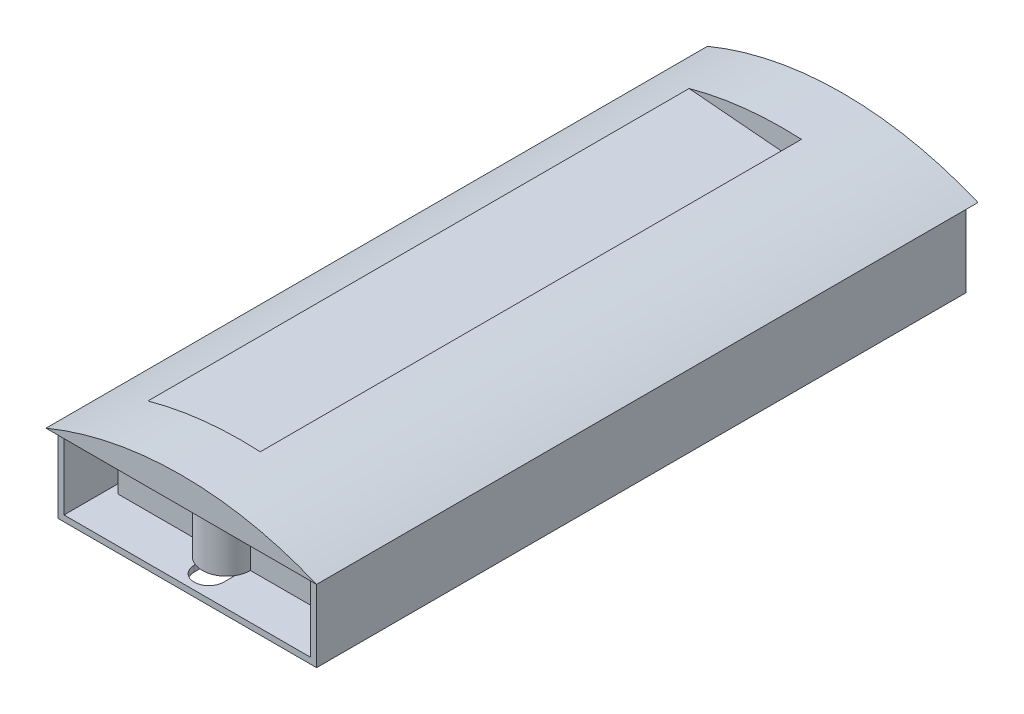
ISO-10303-21;
HEADER;
FILE_DESCRIPTION(('STEP AP214'),'2;1');
FILE_NAME('part.step','',(''),(''),'','','');
FILE_SCHEMA(('AUTOMOTIVE_DESIGN { 1 0 10303 214 1 1 1 1 }'));
ENDSEC;
DATA;
#1=APPLICATION_CONTEXT('core data for automotive mechanical design processes');
#2=APPLICATION_PROTOCOL_DEFINITION('international standard','automotive_design',2000,#1);
#3=PRODUCT_CONTEXT('',#1,'mechanical');
#4=PRODUCT('Part','Part','',(#3));
#5=PRODUCT_RELATED_PRODUCT_CATEGORY('part','',(#4));
#6=PRODUCT_DEFINITION_FORMATION('','',#4);
#7=PRODUCT_DEFINITION_CONTEXT('part definition',#1,'design');
#8=PRODUCT_DEFINITION('design','',#6,#7);
#9=PRODUCT_DEFINITION_SHAPE('','',#8);
#10=(LENGTH_UNIT() NAMED_UNIT(*) SI_UNIT(.MILLI.,.METRE.));
#11=(NAMED_UNIT(*) PLANE_ANGLE_UNIT() SI_UNIT($,.RADIAN.));
#12=(NAMED_UNIT(*) SI_UNIT($,.STERADIAN.) SOLID_ANGLE_UNIT());
#13=UNCERTAINTY_MEASURE_WITH_UNIT(LENGTH_MEASURE(1.E-05),#10,'distance_accuracy_value','');
#14=(GEOMETRIC_REPRESENTATION_CONTEXT(3) GLOBAL_UNCERTAINTY_ASSIGNED_CONTEXT((#13)) GLOBAL_UNIT_ASSIGNED_CONTEXT((#10,
#11,#12)) REPRESENTATION_CONTEXT('',''));
#15=CARTESIAN_POINT('',(0.,0.,0.));
#16=DIRECTION('',(0.,0.,1.));
#17=DIRECTION('',(1.,0.,0.));
#18=AXIS2_PLACEMENT_3D('',#15,#16,#17);
#19=CARTESIAN_POINT('',(0.,-13.,0.));
#20=DIRECTION('',(0.,1.,0.));
#21=DIRECTION('',(0.,0.,1.));
#22=AXIS2_PLACEMENT_3D('',#19,#20,#21);
#23=PLANE('',#22);
#24=CARTESIAN_POINT('',(22.5,-13.,4.6));
#25=DIRECTION('',(0.,-1.,0.));
#26=DIRECTION('',(0.,0.,-1.));
#27=AXIS2_PLACEMENT_3D('',#24,#25,#26);
#28=CIRCLE('',#27,2.45);
#29=CARTESIAN_POINT('',(20.05,-13.,4.6));
#30=VERTEX_POINT('',#29);
#31=CARTESIAN_POINT('',(24.95,-13.,4.60000000000001));
#32=VERTEX_POINT('',#31);
#33=EDGE_CURVE('E244',#30,#32,#28,.T.);
#34=ORIENTED_EDGE('',*,*,#33,.F.);
#35=DIRECTION('',(0.,0.,-1.));
#36=VECTOR('',#35,1.);
#37=CARTESIAN_POINT('',(20.05,-13.,4.6));
#38=LINE('',#37,#36);
#39=CARTESIAN_POINT('',(20.05,-13.,10.4));
#40=VERTEX_POINT('',#39);
#41=EDGE_CURVE('E252',#40,#30,#38,.T.);
#42=ORIENTED_EDGE('',*,*,#41,.F.);
#43=CARTESIAN_POINT('',(22.5,-13.,10.4));
#44=DIRECTION('',(0.,-1.,0.));
#45=DIRECTION('',(0.,0.,-1.));
#46=AXIS2_PLACEMENT_3D('',#43,#44,#45);
#47=CIRCLE('',#46,2.45);
#48=CARTESIAN_POINT('',(24.95,-13.,10.4));
#49=VERTEX_POINT('',#48);
#50=EDGE_CURVE('E249',#49,#40,#47,.T.);
#51=ORIENTED_EDGE('',*,*,#50,.F.);
#52=DIRECTION('',(0.,0.,1.));
#53=VECTOR('',#52,1.);
#54=CARTESIAN_POINT('',(24.95,-13.,4.60000000000001));
#55=LINE('',#54,#53);
#56=EDGE_CURVE('E246',#32,#49,#55,.T.);
#57=ORIENTED_EDGE('',*,*,#56,.F.);
#58=EDGE_LOOP('',(#34,#42,#51,#57));
#59=FACE_BOUND('',#58,.T.);
#60=DIRECTION('',(1.,0.,0.));
#61=VECTOR('',#60,1.);
#62=CARTESIAN_POINT('',(44.,-13.,1.));
#63=LINE('',#62,#61);
#64=CARTESIAN_POINT('',(0.999999999999984,-13.,1.));
#65=VERTEX_POINT('',#64);
#66=CARTESIAN_POINT('',(44.,-13.,1.));
#67=VERTEX_POINT('',#66);
#68=EDGE_CURVE('E278',#65,#67,#63,.T.);
#69=ORIENTED_EDGE('',*,*,#68,.T.);
#70=DIRECTION('',(0.,0.,1.));
#71=VECTOR('',#70,1.);
#72=CARTESIAN_POINT('',(44.,-13.,109.));
#73=LINE('',#72,#71);
#74=CARTESIAN_POINT('',(44.,-13.,109.));
#75=VERTEX_POINT('',#74);
#76=EDGE_CURVE('E281',#67,#75,#73,.T.);
#77=ORIENTED_EDGE('',*,*,#76,.T.);
#78=DIRECTION('',(-1.,0.,0.));
#79=VECTOR('',#78,1.);
#80=CARTESIAN_POINT('',(44.,-13.,109.));
#81=LINE('',#80,#79);
#82=CARTESIAN_POINT('',(0.999999999999984,-13.,109.));
#83=VERTEX_POINT('',#82);
#84=EDGE_CURVE('E171',#75,#83,#81,.T.);
#85=ORIENTED_EDGE('',*,*,#84,.T.);
#86=DIRECTION('',(0.,0.,-1.));
#87=VECTOR('',#86,1.);
#88=CARTESIAN_POINT('',(0.999999999999984,-13.,109.));
#89=LINE('',#88,#87);
#90=EDGE_CURVE('E275',#83,#65,#89,.T.);
#91=ORIENTED_EDGE('',*,*,#90,.T.);
#92=EDGE_LOOP('',(#69,#77,#85,#91));
#93=FACE_BOUND('',#92,.T.);
#94=CARTESIAN_POINT('',(22.5,-13.,105.4));
#95=DIRECTION('',(0.,-1.,0.));
#96=DIRECTION('',(0.,0.,1.));
#97=AXIS2_PLACEMENT_3D('',#94,#95,#96);
#98=CIRCLE('',#97,2.45);
#99=CARTESIAN_POINT('',(24.95,-13.,105.4));
#100=VERTEX_POINT('',#99);
#101=CARTESIAN_POINT('',(20.05,-13.,105.4));
#102=VERTEX_POINT('',#101);
#103=EDGE_CURVE('E215',#100,#102,#98,.T.);
#104=ORIENTED_EDGE('',*,*,#103,.F.);
#105=DIRECTION('',(0.,0.,1.));
#106=VECTOR('',#105,1.);
#107=CARTESIAN_POINT('',(24.95,-13.,105.4));
#108=LINE('',#107,#106);
#109=CARTESIAN_POINT('',(24.95,-13.,99.6));
#110=VERTEX_POINT('',#109);
#111=EDGE_CURVE('E222',#110,#100,#108,.T.);
#112=ORIENTED_EDGE('',*,*,#111,.F.);
#113=CARTESIAN_POINT('',(22.5,-13.,99.6));
#114=DIRECTION('',(0.,-1.,0.));
#115=DIRECTION('',(0.,0.,1.));
#116=AXIS2_PLACEMENT_3D('',#113,#114,#115);
#117=CIRCLE('',#116,2.45);
#118=CARTESIAN_POINT('',(20.05,-13.,99.6));
#119=VERTEX_POINT('',#118);
#120=EDGE_CURVE('E220',#119,#110,#117,.T.);
#121=ORIENTED_EDGE('',*,*,#120,.F.);
#122=DIRECTION('',(0.,0.,-1.));
#123=VECTOR('',#122,1.);
#124=CARTESIAN_POINT('',(20.05,-13.,105.4));
#125=LINE('',#124,#123);
#126=EDGE_CURVE('E217',#102,#119,#125,.T.);
#127=ORIENTED_EDGE('',*,*,#126,.F.);
#128=EDGE_LOOP('',(#104,#112,#121,#127));
#129=FACE_BOUND('',#128,.T.);
#130=ADVANCED_FACE('F49',(#59,#93,#129),#23,.F.);
#131=CARTESIAN_POINT('',(0.,-12.,0.));
#132=DIRECTION('',(0.,1.,0.));
#133=DIRECTION('',(0.,0.,1.));
#134=AXIS2_PLACEMENT_3D('',#131,#132,#133);
#135=PLANE('',#134);
#136=DIRECTION('',(0.,0.,1.));
#137=VECTOR('',#136,1.);
#138=CARTESIAN_POINT('',(43.,-12.,0.));
#139=LINE('',#138,#137);
#140=CARTESIAN_POINT('',(43.,-12.,1.));
#141=VERTEX_POINT('',#140);
#142=CARTESIAN_POINT('',(43.,-12.,109.));
#143=VERTEX_POINT('',#142);
#144=EDGE_CURVE('E196',#141,#143,#139,.T.);
#145=ORIENTED_EDGE('',*,*,#144,.F.);
#146=DIRECTION('',(1.,0.,0.));
#147=VECTOR('',#146,1.);
#148=CARTESIAN_POINT('',(44.,-12.,1.));
#149=LINE('',#148,#147);
#150=CARTESIAN_POINT('',(1.99999999999998,-12.,1.));
#151=VERTEX_POINT('',#150);
#152=EDGE_CURVE('E274',#151,#141,#149,.T.);
#153=ORIENTED_EDGE('',*,*,#152,.F.);
#154=DIRECTION('',(0.,0.,-1.));
#155=VECTOR('',#154,1.);
#156=CARTESIAN_POINT('',(1.99999999999998,-12.,0.));
#157=LINE('',#156,#155);
#158=CARTESIAN_POINT('',(1.99999999999998,-12.,109.));
#159=VERTEX_POINT('',#158);
#160=EDGE_CURVE('E203',#159,#151,#157,.T.);
#161=ORIENTED_EDGE('',*,*,#160,.F.);
#162=DIRECTION('',(-1.,0.,0.));
#163=VECTOR('',#162,1.);
#164=CARTESIAN_POINT('',(44.,-12.,109.));
#165=LINE('',#164,#163);
#166=EDGE_CURVE('E279',#143,#159,#165,.T.);
#167=ORIENTED_EDGE('',*,*,#166,.F.);
#168=EDGE_LOOP('',(#145,#153,#161,#167));
#169=FACE_BOUND('',#168,.T.);
#170=DIRECTION('',(0.,0.,-1.));
#171=VECTOR('',#170,1.);
#172=CARTESIAN_POINT('',(20.05,-12.,4.6));
#173=LINE('',#172,#171);
#174=CARTESIAN_POINT('',(20.05,-12.,10.4));
#175=VERTEX_POINT('',#174);
#176=CARTESIAN_POINT('',(20.05,-12.,4.6));
#177=VERTEX_POINT('',#176);
#178=EDGE_CURVE('E247',#175,#177,#173,.T.);
#179=ORIENTED_EDGE('',*,*,#178,.T.);
#180=CARTESIAN_POINT('',(22.5,-12.,4.6));
#181=DIRECTION('',(0.,-1.,0.));
#182=DIRECTION('',(0.,0.,-1.));
#183=AXIS2_PLACEMENT_3D('',#180,#181,#182);
#184=CIRCLE('',#183,2.45);
#185=CARTESIAN_POINT('',(24.95,-12.,4.60000000000001));
#186=VERTEX_POINT('',#185);
#187=EDGE_CURVE('E243',#177,#186,#184,.T.);
#188=ORIENTED_EDGE('',*,*,#187,.T.);
#189=DIRECTION('',(0.,0.,1.));
#190=VECTOR('',#189,1.);
#191=CARTESIAN_POINT('',(24.95,-12.,4.60000000000001));
#192=LINE('',#191,#190);
#193=CARTESIAN_POINT('',(24.95,-12.,10.4));
#194=VERTEX_POINT('',#193);
#195=EDGE_CURVE('E257',#186,#194,#192,.T.);
#196=ORIENTED_EDGE('',*,*,#195,.T.);
#197=CARTESIAN_POINT('',(22.5,-12.,10.4));
#198=DIRECTION('',(0.,-1.,0.));
#199=DIRECTION('',(0.,0.,-1.));
#200=AXIS2_PLACEMENT_3D('',#197,#198,#199);
#201=CIRCLE('',#200,2.45);
#202=EDGE_CURVE('E260',#194,#175,#201,.T.);
#203=ORIENTED_EDGE('',*,*,#202,.T.);
#204=EDGE_LOOP('',(#179,#188,#196,#203));
#205=FACE_BOUND('',#204,.T.);
#206=DIRECTION('',(0.,0.,1.));
#207=VECTOR('',#206,1.);
#208=CARTESIAN_POINT('',(24.95,-12.,105.4));
#209=LINE('',#208,#207);
#210=CARTESIAN_POINT('',(24.95,-12.,99.6));
#211=VERTEX_POINT('',#210);
#212=CARTESIAN_POINT('',(24.95,-12.,105.4));
#213=VERTEX_POINT('',#212);
#214=EDGE_CURVE('E218',#211,#213,#209,.T.);
#215=ORIENTED_EDGE('',*,*,#214,.T.);
#216=CARTESIAN_POINT('',(22.5,-12.,105.4));
#217=DIRECTION('',(0.,-1.,0.));
#218=DIRECTION('',(0.,0.,1.));
#219=AXIS2_PLACEMENT_3D('',#216,#217,#218);
#220=CIRCLE('',#219,2.45);
#221=CARTESIAN_POINT('',(20.05,-12.,105.4));
#222=VERTEX_POINT('',#221);
#223=EDGE_CURVE('E214',#213,#222,#220,.T.);
#224=ORIENTED_EDGE('',*,*,#223,.T.);
#225=DIRECTION('',(0.,0.,-1.));
#226=VECTOR('',#225,1.);
#227=CARTESIAN_POINT('',(20.05,-12.,105.4));
#228=LINE('',#227,#226);
#229=CARTESIAN_POINT('',(20.05,-12.,99.6));
#230=VERTEX_POINT('',#229);
#231=EDGE_CURVE('E227',#222,#230,#228,.T.);
#232=ORIENTED_EDGE('',*,*,#231,.T.);
#233=CARTESIAN_POINT('',(22.5,-12.,99.6));
#234=DIRECTION('',(0.,-1.,0.));
#235=DIRECTION('',(0.,0.,1.));
#236=AXIS2_PLACEMENT_3D('',#233,#234,#235);
#237=CIRCLE('',#236,2.45);
#238=EDGE_CURVE('E230',#230,#211,#237,.T.);
#239=ORIENTED_EDGE('',*,*,#238,.T.);
#240=EDGE_LOOP('',(#215,#224,#232,#239));
#241=FACE_BOUND('',#240,.T.);
#242=ADVANCED_FACE('F303',(#169,#205,#241),#135,.T.);
#243=CARTESIAN_POINT('',(0.999999999999984,-13.,109.));
#244=DIRECTION('',(1.,0.,0.));
#245=DIRECTION('',(0.,0.,-1.));
#246=AXIS2_PLACEMENT_3D('',#243,#244,#245);
#247=PLANE('',#246);
#248=DIRECTION('',(0.,1.,0.));
#249=VECTOR('',#248,1.);
#250=CARTESIAN_POINT('',(0.999999999999984,-13.,109.));
#251=LINE('',#250,#249);
#252=CARTESIAN_POINT('',(0.999999999999984,-1.,109.));
#253=VERTEX_POINT('',#252);
#254=EDGE_CURVE('E174',#83,#253,#251,.T.);
#255=ORIENTED_EDGE('',*,*,#254,.T.);
#256=DIRECTION('',(0.,0.,1.));
#257=VECTOR('',#256,1.);
#258=CARTESIAN_POINT('',(0.999999999999984,-1.,-11.0415945787923));
#259=LINE('',#258,#257);
#260=CARTESIAN_POINT('',(0.999999999999984,-1.,1.));
#261=VERTEX_POINT('',#260);
#262=EDGE_CURVE('E201',#261,#253,#259,.T.);
#263=ORIENTED_EDGE('',*,*,#262,.F.);
#264=DIRECTION('',(0.,1.,0.));
#265=VECTOR('',#264,1.);
#266=CARTESIAN_POINT('',(0.999999999999984,-13.,1.));
#267=LINE('',#266,#265);
#268=EDGE_CURVE('E12',#65,#261,#267,.T.);
#269=ORIENTED_EDGE('',*,*,#268,.F.);
#270=ORIENTED_EDGE('',*,*,#90,.F.);
#271=EDGE_LOOP('',(#255,#263,#269,#270));
#272=FACE_BOUND('',#271,.T.);
#273=ADVANCED_FACE('F51',(#272),#247,.F.);
#274=CARTESIAN_POINT('',(44.,-13.,1.));
#275=DIRECTION('',(0.,0.,1.));
#276=DIRECTION('',(1.,0.,0.));
#277=AXIS2_PLACEMENT_3D('',#274,#275,#276);
#278=PLANE('',#277);
#279=ORIENTED_EDGE('',*,*,#152,.T.);
#280=DIRECTION('',(0.,1.,0.));
#281=VECTOR('',#280,1.);
#282=CARTESIAN_POINT('',(43.,-13.,1.));
#283=LINE('',#282,#281);
#284=CARTESIAN_POINT('',(43.,-0.999999999999996,1.));
#285=VERTEX_POINT('',#284);
#286=EDGE_CURVE('E191',#141,#285,#283,.T.);
#287=ORIENTED_EDGE('',*,*,#286,.T.);
#288=DIRECTION('',(1.,0.,0.));
#289=VECTOR('',#288,1.);
#290=CARTESIAN_POINT('',(44.,-0.999999999999996,1.));
#291=LINE('',#290,#289);
#292=CARTESIAN_POINT('',(44.,-0.999999999999996,1.));
#293=VERTEX_POINT('',#292);
#294=EDGE_CURVE('E194',#285,#293,#291,.T.);
#295=ORIENTED_EDGE('',*,*,#294,.T.);
#296=DIRECTION('',(0.,1.,0.));
#297=VECTOR('',#296,1.);
#298=CARTESIAN_POINT('',(44.,-13.,1.));
#299=LINE('',#298,#297);
#300=EDGE_CURVE('E57',#67,#293,#299,.T.);
#301=ORIENTED_EDGE('',*,*,#300,.F.);
#302=ORIENTED_EDGE('',*,*,#68,.F.);
#303=ORIENTED_EDGE('',*,*,#268,.T.);
#304=DIRECTION('',(1.,0.,0.));
#305=VECTOR('',#304,1.);
#306=CARTESIAN_POINT('',(0.999999999999984,-1.,1.));
#307=LINE('',#306,#305);
#308=CARTESIAN_POINT('',(1.99999999999998,-1.,1.));
#309=VERTEX_POINT('',#308);
#310=EDGE_CURVE('E200',#261,#309,#307,.T.);
#311=ORIENTED_EDGE('',*,*,#310,.T.);
#312=DIRECTION('',(0.,-1.,0.));
#313=VECTOR('',#312,1.);
#314=CARTESIAN_POINT('',(1.99999999999998,-13.,1.));
#315=LINE('',#314,#313);
#316=EDGE_CURVE('E64',#309,#151,#315,.T.);
#317=ORIENTED_EDGE('',*,*,#316,.T.);
#318=EDGE_LOOP('',(#279,#287,#295,#301,#302,#303,#311,#317));
#319=FACE_BOUND('',#318,.T.);
#320=ADVANCED_FACE('F305',(#319),#278,.F.);
#321=CARTESIAN_POINT('',(44.,-13.,109.));
#322=DIRECTION('',(-1.,0.,0.));
#323=DIRECTION('',(0.,0.,1.));
#324=AXIS2_PLACEMENT_3D('',#321,#322,#323);
#325=PLANE('',#324);
#326=ORIENTED_EDGE('',*,*,#300,.T.);
#327=DIRECTION('',(0.,0.,1.));
#328=VECTOR('',#327,1.);
#329=CARTESIAN_POINT('',(44.,-0.999999999999996,-11.0415945787923));
#330=LINE('',#329,#328);
#331=CARTESIAN_POINT('',(44.,-0.999999999999996,109.));
#332=VERTEX_POINT('',#331);
#333=EDGE_CURVE('E177',#293,#332,#330,.T.);
#334=ORIENTED_EDGE('',*,*,#333,.T.);
#335=DIRECTION('',(0.,1.,0.));
#336=VECTOR('',#335,1.);
#337=CARTESIAN_POINT('',(44.,-13.,109.));
#338=LINE('',#337,#336);
#339=EDGE_CURVE('E163',#75,#332,#338,.T.);
#340=ORIENTED_EDGE('',*,*,#339,.F.);
#341=ORIENTED_EDGE('',*,*,#76,.F.);
#342=EDGE_LOOP('',(#326,#334,#340,#341));
#343=FACE_BOUND('',#342,.T.);
#344=ADVANCED_FACE('F178',(#343),#325,.F.);
#345=CARTESIAN_POINT('',(44.,-13.,109.));
#346=DIRECTION('',(0.,0.,-1.));
#347=DIRECTION('',(-1.,0.,0.));
#348=AXIS2_PLACEMENT_3D('',#345,#346,#347);
#349=PLANE('',#348);
#350=ORIENTED_EDGE('',*,*,#254,.F.);
#351=ORIENTED_EDGE('',*,*,#84,.F.);
#352=ORIENTED_EDGE('',*,*,#339,.T.);
#353=DIRECTION('',(-1.,0.,0.));
#354=VECTOR('',#353,1.);
#355=CARTESIAN_POINT('',(44.,-0.999999999999996,109.));
#356=LINE('',#355,#354);
#357=CARTESIAN_POINT('',(43.,-0.999999999999996,109.));
#358=VERTEX_POINT('',#357);
#359=EDGE_CURVE('E169',#332,#358,#356,.T.);
#360=ORIENTED_EDGE('',*,*,#359,.T.);
#361=DIRECTION('',(0.,-1.,0.));
#362=VECTOR('',#361,1.);
#363=CARTESIAN_POINT('',(43.,-13.,109.));
#364=LINE('',#363,#362);
#365=EDGE_CURVE('E184',#358,#143,#364,.T.);
#366=ORIENTED_EDGE('',*,*,#365,.T.);
#367=ORIENTED_EDGE('',*,*,#166,.T.);
#368=DIRECTION('',(0.,1.,0.));
#369=VECTOR('',#368,1.);
#370=CARTESIAN_POINT('',(1.99999999999998,-13.,109.));
#371=LINE('',#370,#369);
#372=CARTESIAN_POINT('',(1.99999999999998,-1.,109.));
#373=VERTEX_POINT('',#372);
#374=EDGE_CURVE('E198',#159,#373,#371,.T.);
#375=ORIENTED_EDGE('',*,*,#374,.T.);
#376=DIRECTION('',(-1.,0.,0.));
#377=VECTOR('',#376,1.);
#378=CARTESIAN_POINT('',(0.999999999999984,-1.,109.));
#379=LINE('',#378,#377);
#380=EDGE_CURVE('E205',#373,#253,#379,.T.);
#381=ORIENTED_EDGE('',*,*,#380,.T.);
#382=EDGE_LOOP('',(#350,#351,#352,#360,#366,#367,#375,#381));
#383=FACE_BOUND('',#382,.T.);
#384=ADVANCED_FACE('F166',(#383),#349,.F.);
#385=CARTESIAN_POINT('',(22.5,-13.,4.6));
#386=DIRECTION('',(0.,1.,0.));
#387=DIRECTION('',(0.,0.,1.));
#388=AXIS2_PLACEMENT_3D('',#385,#386,#387);
#389=CYLINDRICAL_SURFACE('',#388,2.45);
#390=ORIENTED_EDGE('',*,*,#187,.F.);
#391=DIRECTION('',(0.,1.,0.));
#392=VECTOR('',#391,1.);
#393=CARTESIAN_POINT('',(20.05,-13.,4.6));
#394=LINE('',#393,#392);
#395=EDGE_CURVE('E254',#30,#177,#394,.T.);
#396=ORIENTED_EDGE('',*,*,#395,.F.);
#397=ORIENTED_EDGE('',*,*,#33,.T.);
#398=DIRECTION('',(0.,1.,0.));
#399=VECTOR('',#398,1.);
#400=CARTESIAN_POINT('',(24.95,-13.,4.60000000000001));
#401=LINE('',#400,#399);
#402=EDGE_CURVE('E271',#32,#186,#401,.T.);
#403=ORIENTED_EDGE('',*,*,#402,.T.);
#404=EDGE_LOOP('',(#390,#396,#397,#403));
#405=FACE_BOUND('',#404,.T.);
#406=ADVANCED_FACE('F326',(#405),#389,.F.);
#407=CARTESIAN_POINT('',(24.95,-13.,4.60000000000001));
#408=DIRECTION('',(-1.,0.,0.));
#409=DIRECTION('',(0.,0.,1.));
#410=AXIS2_PLACEMENT_3D('',#407,#408,#409);
#411=PLANE('',#410);
#412=ORIENTED_EDGE('',*,*,#195,.F.);
#413=ORIENTED_EDGE('',*,*,#402,.F.);
#414=ORIENTED_EDGE('',*,*,#56,.T.);
#415=DIRECTION('',(0.,1.,0.));
#416=VECTOR('',#415,1.);
#417=CARTESIAN_POINT('',(24.95,-13.,10.4));
#418=LINE('',#417,#416);
#419=EDGE_CURVE('E269',#49,#194,#418,.T.);
#420=ORIENTED_EDGE('',*,*,#419,.T.);
#421=EDGE_LOOP('',(#412,#413,#414,#420));
#422=FACE_BOUND('',#421,.T.);
#423=ADVANCED_FACE('F407',(#422),#411,.T.);
#424=CARTESIAN_POINT('',(22.5,-13.,10.4));
#425=DIRECTION('',(0.,1.,0.));
#426=DIRECTION('',(0.,0.,1.));
#427=AXIS2_PLACEMENT_3D('',#424,#425,#426);
#428=CYLINDRICAL_SURFACE('',#427,2.45);
#429=ORIENTED_EDGE('',*,*,#202,.F.);
#430=ORIENTED_EDGE('',*,*,#419,.F.);
#431=ORIENTED_EDGE('',*,*,#50,.T.);
#432=DIRECTION('',(0.,1.,0.));
#433=VECTOR('',#432,1.);
#434=CARTESIAN_POINT('',(20.05,-13.,10.4));
#435=LINE('',#434,#433);
#436=EDGE_CURVE('E267',#40,#175,#435,.T.);
#437=ORIENTED_EDGE('',*,*,#436,.T.);
#438=EDGE_LOOP('',(#429,#430,#431,#437));
#439=FACE_BOUND('',#438,.T.);
#440=ADVANCED_FACE('F397',(#439),#428,.F.);
#441=CARTESIAN_POINT('',(20.05,-13.,4.6));
#442=DIRECTION('',(1.,0.,0.));
#443=DIRECTION('',(0.,0.,-1.));
#444=AXIS2_PLACEMENT_3D('',#441,#442,#443);
#445=PLANE('',#444);
#446=ORIENTED_EDGE('',*,*,#178,.F.);
#447=ORIENTED_EDGE('',*,*,#436,.F.);
#448=ORIENTED_EDGE('',*,*,#41,.T.);
#449=ORIENTED_EDGE('',*,*,#395,.T.);
#450=EDGE_LOOP('',(#446,#447,#448,#449));
#451=FACE_BOUND('',#450,.T.);
#452=ADVANCED_FACE('F387',(#451),#445,.T.);
#453=CARTESIAN_POINT('',(22.5,-13.,105.4));
#454=DIRECTION('',(0.,1.,0.));
#455=DIRECTION('',(0.,0.,1.));
#456=AXIS2_PLACEMENT_3D('',#453,#454,#455);
#457=CYLINDRICAL_SURFACE('',#456,2.45);
#458=ORIENTED_EDGE('',*,*,#223,.F.);
#459=DIRECTION('',(0.,1.,0.));
#460=VECTOR('',#459,1.);
#461=CARTESIAN_POINT('',(24.95,-13.,105.4));
#462=LINE('',#461,#460);
#463=EDGE_CURVE('E224',#100,#213,#462,.T.);
#464=ORIENTED_EDGE('',*,*,#463,.F.);
#465=ORIENTED_EDGE('',*,*,#103,.T.);
#466=DIRECTION('',(0.,1.,0.));
#467=VECTOR('',#466,1.);
#468=CARTESIAN_POINT('',(20.05,-13.,105.4));
#469=LINE('',#468,#467);
#470=EDGE_CURVE('E240',#102,#222,#469,.T.);
#471=ORIENTED_EDGE('',*,*,#470,.T.);
#472=EDGE_LOOP('',(#458,#464,#465,#471));
#473=FACE_BOUND('',#472,.T.);
#474=ADVANCED_FACE('F377',(#473),#457,.F.);
#475=CARTESIAN_POINT('',(20.05,-13.,105.4));
#476=DIRECTION('',(1.,0.,0.));
#477=DIRECTION('',(0.,0.,-1.));
#478=AXIS2_PLACEMENT_3D('',#475,#476,#477);
#479=PLANE('',#478);
#480=ORIENTED_EDGE('',*,*,#231,.F.);
#481=ORIENTED_EDGE('',*,*,#470,.F.);
#482=ORIENTED_EDGE('',*,*,#126,.T.);
#483=DIRECTION('',(0.,1.,0.));
#484=VECTOR('',#483,1.);
#485=CARTESIAN_POINT('',(20.05,-13.,99.6));
#486=LINE('',#485,#484);
#487=EDGE_CURVE('E238',#119,#230,#486,.T.);
#488=ORIENTED_EDGE('',*,*,#487,.T.);
#489=EDGE_LOOP('',(#480,#481,#482,#488));
#490=FACE_BOUND('',#489,.T.);
#491=ADVANCED_FACE('F367',(#490),#479,.T.);
#492=CARTESIAN_POINT('',(22.5,-13.,99.6));
#493=DIRECTION('',(0.,1.,0.));
#494=DIRECTION('',(0.,0.,1.));
#495=AXIS2_PLACEMENT_3D('',#492,#493,#494);
#496=CYLINDRICAL_SURFACE('',#495,2.45);
#497=ORIENTED_EDGE('',*,*,#238,.F.);
#498=ORIENTED_EDGE('',*,*,#487,.F.);
#499=ORIENTED_EDGE('',*,*,#120,.T.);
#500=DIRECTION('',(0.,1.,0.));
#501=VECTOR('',#500,1.);
#502=CARTESIAN_POINT('',(24.95,-13.,99.6));
#503=LINE('',#502,#501);
#504=EDGE_CURVE('E72',#110,#211,#503,.T.);
#505=ORIENTED_EDGE('',*,*,#504,.T.);
#506=EDGE_LOOP('',(#497,#498,#499,#505));
#507=FACE_BOUND('',#506,.T.);
#508=ADVANCED_FACE('F357',(#507),#496,.F.);
#509=CARTESIAN_POINT('',(24.95,-13.,105.4));
#510=DIRECTION('',(-1.,0.,0.));
#511=DIRECTION('',(0.,0.,1.));
#512=AXIS2_PLACEMENT_3D('',#509,#510,#511);
#513=PLANE('',#512);
#514=ORIENTED_EDGE('',*,*,#214,.F.);
#515=ORIENTED_EDGE('',*,*,#504,.F.);
#516=ORIENTED_EDGE('',*,*,#111,.T.);
#517=ORIENTED_EDGE('',*,*,#463,.T.);
#518=EDGE_LOOP('',(#514,#515,#516,#517));
#519=FACE_BOUND('',#518,.T.);
#520=ADVANCED_FACE('F352',(#519),#513,.T.);
#521=CARTESIAN_POINT('',(0.999999999999984,-1.,-11.0415945787923));
#522=DIRECTION('',(0.,1.,0.));
#523=DIRECTION('',(0.,0.,1.));
#524=AXIS2_PLACEMENT_3D('',#521,#522,#523);
#525=PLANE('',#524);
#526=ORIENTED_EDGE('',*,*,#310,.F.);
#527=ORIENTED_EDGE('',*,*,#262,.T.);
#528=ORIENTED_EDGE('',*,*,#380,.F.);
#529=DIRECTION('',(0.,0.,1.));
#530=VECTOR('',#529,1.);
#531=CARTESIAN_POINT('',(1.99999999999998,-1.,-11.0415945787923));
#532=LINE('',#531,#530);
#533=EDGE_CURVE('E208',#309,#373,#532,.T.);
#534=ORIENTED_EDGE('',*,*,#533,.F.);
#535=EDGE_LOOP('',(#526,#527,#528,#534));
#536=FACE_BOUND('',#535,.T.);
#537=ADVANCED_FACE('F293',(#536),#525,.T.);
#538=CARTESIAN_POINT('',(1.99999999999998,-13.,-11.0415945787923));
#539=DIRECTION('',(1.,0.,0.));
#540=DIRECTION('',(0.,0.,-1.));
#541=AXIS2_PLACEMENT_3D('',#538,#539,#540);
#542=PLANE('',#541);
#543=ORIENTED_EDGE('',*,*,#374,.F.);
#544=ORIENTED_EDGE('',*,*,#160,.T.);
#545=ORIENTED_EDGE('',*,*,#316,.F.);
#546=ORIENTED_EDGE('',*,*,#533,.T.);
#547=EDGE_LOOP('',(#543,#544,#545,#546));
#548=FACE_BOUND('',#547,.T.);
#549=ADVANCED_FACE('F299',(#548),#542,.T.);
#550=CARTESIAN_POINT('',(43.,-13.,-11.0415945787923));
#551=DIRECTION('',(-1.,0.,0.));
#552=DIRECTION('',(0.,0.,1.));
#553=AXIS2_PLACEMENT_3D('',#550,#551,#552);
#554=PLANE('',#553);
#555=ORIENTED_EDGE('',*,*,#286,.F.);
#556=ORIENTED_EDGE('',*,*,#144,.T.);
#557=ORIENTED_EDGE('',*,*,#365,.F.);
#558=DIRECTION('',(0.,0.,1.));
#559=VECTOR('',#558,1.);
#560=CARTESIAN_POINT('',(43.,-0.999999999999996,-11.0415945787923));
#561=LINE('',#560,#559);
#562=EDGE_CURVE('E183',#285,#358,#561,.T.);
#563=ORIENTED_EDGE('',*,*,#562,.F.);
#564=EDGE_LOOP('',(#555,#556,#557,#563));
#565=FACE_BOUND('',#564,.T.);
#566=ADVANCED_FACE('F307',(#565),#554,.T.);
#567=CARTESIAN_POINT('',(44.,-0.999999999999996,-11.0415945787923));
#568=DIRECTION('',(0.,1.,0.));
#569=DIRECTION('',(-1.,0.,0.));
#570=AXIS2_PLACEMENT_3D('',#567,#568,#569);
#571=PLANE('',#570);
#572=ORIENTED_EDGE('',*,*,#294,.F.);
#573=ORIENTED_EDGE('',*,*,#562,.T.);
#574=ORIENTED_EDGE('',*,*,#359,.F.);
#575=ORIENTED_EDGE('',*,*,#333,.F.);
#576=EDGE_LOOP('',(#572,#573,#574,#575));
#577=FACE_BOUND('',#576,.T.);
#578=ADVANCED_FACE('F186',(#577),#571,.T.);
#579=CLOSED_SHELL('',(#130,#242,#273,#320,#344,#384,#406,#423,#440,#452,#474,#491,#508,#520,
#537,#549,#566,#578));
#580=MANIFOLD_SOLID_BREP('B2',#579);
#581=CARTESIAN_POINT('',(22.5,-54.,110.));
#582=DIRECTION('',(0.,0.,-1.));
#583=DIRECTION('',(-1.,0.,0.));
#584=AXIS2_PLACEMENT_3D('',#581,#582,#583);
#585=CYLINDRICAL_SURFACE('',#584,58.5);
#586=CARTESIAN_POINT('',(22.5,-54.,0.));
#587=DIRECTION('',(0.,0.,1.));
#588=DIRECTION('',(-1.,0.,0.));
#589=AXIS2_PLACEMENT_3D('',#586,#587,#588);
#590=CIRCLE('',#589,58.5);
#591=CARTESIAN_POINT('',(45.,0.,0.));
#592=VERTEX_POINT('',#591);
#593=CARTESIAN_POINT('',(0.,0.,0.));
#594=VERTEX_POINT('',#593);
#595=EDGE_CURVE('E700',#592,#594,#590,.T.);
#596=ORIENTED_EDGE('',*,*,#595,.T.);
#597=DIRECTION('',(0.,0.,-1.));
#598=VECTOR('',#597,1.);
#599=CARTESIAN_POINT('',(0.,0.,110.));
#600=LINE('',#599,#598);
#601=CARTESIAN_POINT('',(0.,0.,110.));
#602=VERTEX_POINT('',#601);
#603=EDGE_CURVE('E613',#602,#594,#600,.T.);
#604=ORIENTED_EDGE('',*,*,#603,.F.);
#605=CARTESIAN_POINT('',(22.5,-54.,110.));
#606=DIRECTION('',(0.,0.,1.));
#607=DIRECTION('',(-1.,0.,0.));
#608=AXIS2_PLACEMENT_3D('',#605,#606,#607);
#609=CIRCLE('',#608,58.5);
#610=CARTESIAN_POINT('',(45.,0.,110.));
#611=VERTEX_POINT('',#610);
#612=EDGE_CURVE('E701',#611,#602,#609,.T.);
#613=ORIENTED_EDGE('',*,*,#612,.F.);
#614=DIRECTION('',(0.,0.,-1.));
#615=VECTOR('',#614,1.);
#616=CARTESIAN_POINT('',(45.,0.,110.));
#617=LINE('',#616,#615);
#618=EDGE_CURVE('E707',#611,#592,#617,.T.);
#619=ORIENTED_EDGE('',*,*,#618,.T.);
#620=EDGE_LOOP('',(#596,#604,#613,#619));
#621=FACE_BOUND('',#620,.T.);
#622=CARTESIAN_POINT('',(22.5,-54.,9.99999999999999));
#623=DIRECTION('',(0.,0.,1.));
#624=DIRECTION('',(1.,0.,0.));
#625=AXIS2_PLACEMENT_3D('',#622,#623,#624);
#626=CIRCLE('',#625,58.5);
#627=CARTESIAN_POINT('',(25.6355375998647,4.415908825934,10.));
#628=VERTEX_POINT('',#627);
#629=CARTESIAN_POINT('',(6.95185149151565,2.39596685897064,9.99999999999999));
#630=VERTEX_POINT('',#629);
#631=EDGE_CURVE('E47',#628,#630,#626,.T.);
#632=ORIENTED_EDGE('',*,*,#631,.F.);
#633=DIRECTION('',(0.,0.,1.));
#634=VECTOR('',#633,1.);
#635=CARTESIAN_POINT('',(25.6355375998647,4.415908825934,10.));
#636=LINE('',#635,#634);
#637=CARTESIAN_POINT('',(25.6355375998647,4.415908825934,100.));
#638=VERTEX_POINT('',#637);
#639=EDGE_CURVE('E618',#628,#638,#636,.T.);
#640=ORIENTED_EDGE('',*,*,#639,.T.);
#641=CARTESIAN_POINT('',(22.5,-54.,100.));
#642=DIRECTION('',(0.,0.,1.));
#643=DIRECTION('',(1.,0.,0.));
#644=AXIS2_PLACEMENT_3D('',#641,#642,#643);
#645=CIRCLE('',#644,58.5);
#646=CARTESIAN_POINT('',(6.95185149151565,2.39596685897064,100.));
#647=VERTEX_POINT('',#646);
#648=EDGE_CURVE('E606',#638,#647,#645,.T.);
#649=ORIENTED_EDGE('',*,*,#648,.T.);
#650=DIRECTION('',(0.,0.,-1.));
#651=VECTOR('',#650,1.);
#652=CARTESIAN_POINT('',(6.95185149151565,2.39596685897064,110.));
#653=LINE('',#652,#651);
#654=EDGE_CURVE('E514',#630,#647,#653,.F.);
#655=ORIENTED_EDGE('',*,*,#654,.F.);
#656=EDGE_LOOP('',(#632,#640,#649,#655));
#657=FACE_BOUND('',#656,.T.);
#658=ADVANCED_FACE('F507',(#621,#657),#585,.T.);
#659=CARTESIAN_POINT('',(0.,0.,110.));
#660=DIRECTION('',(0.,1.,0.));
#661=DIRECTION('',(0.,0.,1.));
#662=AXIS2_PLACEMENT_3D('',#659,#660,#661);
#663=PLANE('',#662);
#664=DIRECTION('',(1.,0.,0.));
#665=VECTOR('',#664,1.);
#666=CARTESIAN_POINT('',(0.,0.,0.));
#667=LINE('',#666,#665);
#668=EDGE_CURVE('E705',#594,#592,#667,.T.);
#669=ORIENTED_EDGE('',*,*,#668,.T.);
#670=ORIENTED_EDGE('',*,*,#618,.F.);
#671=DIRECTION('',(1.,0.,0.));
#672=VECTOR('',#671,1.);
#673=CARTESIAN_POINT('',(0.,0.,110.));
#674=LINE('',#673,#672);
#675=EDGE_CURVE('E704',#602,#611,#674,.T.);
#676=ORIENTED_EDGE('',*,*,#675,.F.);
#677=ORIENTED_EDGE('',*,*,#603,.T.);
#678=EDGE_LOOP('',(#669,#670,#676,#677));
#679=FACE_BOUND('',#678,.T.);
#680=DIRECTION('',(1.,0.,0.));
#681=VECTOR('',#680,1.);
#682=CARTESIAN_POINT('',(0.,0.,7.50000000000001));
#683=LINE('',#682,#681);
#684=CARTESIAN_POINT('',(4.49999999999999,0.,7.50000000000001));
#685=VERTEX_POINT('',#684);
#686=CARTESIAN_POINT('',(18.5,0.,7.5));
#687=VERTEX_POINT('',#686);
#688=EDGE_CURVE('E637',#685,#687,#683,.T.);
#689=ORIENTED_EDGE('',*,*,#688,.F.);
#690=DIRECTION('',(0.,0.,1.));
#691=VECTOR('',#690,1.);
#692=CARTESIAN_POINT('',(4.49999999999999,0.,0.));
#693=LINE('',#692,#691);
#694=CARTESIAN_POINT('',(4.49999999999998,0.,102.5));
#695=VERTEX_POINT('',#694);
#696=EDGE_CURVE('E647',#685,#695,#693,.T.);
#697=ORIENTED_EDGE('',*,*,#696,.T.);
#698=DIRECTION('',(1.,0.,0.));
#699=VECTOR('',#698,1.);
#700=CARTESIAN_POINT('',(0.,0.,102.5));
#701=LINE('',#700,#699);
#702=CARTESIAN_POINT('',(18.5,0.,102.5));
#703=VERTEX_POINT('',#702);
#704=EDGE_CURVE('E529',#695,#703,#701,.T.);
#705=ORIENTED_EDGE('',*,*,#704,.T.);
#706=CARTESIAN_POINT('',(22.5,0.,102.5));
#707=DIRECTION('',(0.,-1.,0.));
#708=DIRECTION('',(0.,0.,-1.));
#709=AXIS2_PLACEMENT_3D('',#706,#707,#708);
#710=CIRCLE('',#709,4.);
#711=CARTESIAN_POINT('',(26.5,0.,102.5));
#712=VERTEX_POINT('',#711);
#713=EDGE_CURVE('E677',#712,#703,#710,.T.);
#714=ORIENTED_EDGE('',*,*,#713,.F.);
#715=DIRECTION('',(1.,0.,0.));
#716=VECTOR('',#715,1.);
#717=CARTESIAN_POINT('',(0.,0.,102.5));
#718=LINE('',#717,#716);
#719=CARTESIAN_POINT('',(40.5,0.,102.5));
#720=VERTEX_POINT('',#719);
#721=EDGE_CURVE('E674',#712,#720,#718,.T.);
#722=ORIENTED_EDGE('',*,*,#721,.T.);
#723=DIRECTION('',(0.,0.,1.));
#724=VECTOR('',#723,1.);
#725=CARTESIAN_POINT('',(40.5,0.,0.));
#726=LINE('',#725,#724);
#727=CARTESIAN_POINT('',(40.5,0.,7.5));
#728=VERTEX_POINT('',#727);
#729=EDGE_CURVE('E671',#728,#720,#726,.T.);
#730=ORIENTED_EDGE('',*,*,#729,.F.);
#731=DIRECTION('',(1.,0.,0.));
#732=VECTOR('',#731,1.);
#733=CARTESIAN_POINT('',(0.,0.,7.50000000000001));
#734=LINE('',#733,#732);
#735=CARTESIAN_POINT('',(26.5,0.,7.5));
#736=VERTEX_POINT('',#735);
#737=EDGE_CURVE('E669',#736,#728,#734,.T.);
#738=ORIENTED_EDGE('',*,*,#737,.F.);
#739=CARTESIAN_POINT('',(22.5,0.,7.50000000000002));
#740=DIRECTION('',(0.,-1.,0.));
#741=DIRECTION('',(0.,0.,-1.));
#742=AXIS2_PLACEMENT_3D('',#739,#740,#741);
#743=CIRCLE('',#742,4.);
#744=EDGE_CURVE('E667',#687,#736,#743,.T.);
#745=ORIENTED_EDGE('',*,*,#744,.F.);
#746=EDGE_LOOP('',(#689,#697,#705,#714,#722,#730,#738,#745));
#747=FACE_BOUND('',#746,.T.);
#748=ADVANCED_FACE('F742',(#679,#747),#663,.F.);
#749=CARTESIAN_POINT('',(22.5,-54.,110.));
#750=DIRECTION('',(0.,0.,-1.));
#751=DIRECTION('',(-1.,0.,0.));
#752=AXIS2_PLACEMENT_3D('',#749,#750,#751);
#753=PLANE('',#752);
#754=ORIENTED_EDGE('',*,*,#612,.T.);
#755=ORIENTED_EDGE('',*,*,#675,.T.);
#756=EDGE_LOOP('',(#754,#755));
#757=FACE_BOUND('',#756,.T.);
#758=ADVANCED_FACE('F747',(#757),#753,.F.);
#759=CARTESIAN_POINT('',(22.5,-54.,0.));
#760=DIRECTION('',(0.,0.,-1.));
#761=DIRECTION('',(-1.,0.,0.));
#762=AXIS2_PLACEMENT_3D('',#759,#760,#761);
#763=PLANE('',#762);
#764=ORIENTED_EDGE('',*,*,#595,.F.);
#765=ORIENTED_EDGE('',*,*,#668,.F.);
#766=EDGE_LOOP('',(#764,#765));
#767=FACE_BOUND('',#766,.T.);
#768=ADVANCED_FACE('F754',(#767),#763,.T.);
#769=CARTESIAN_POINT('',(0.,-11.,7.50000000000001));
#770=DIRECTION('',(0.,0.,1.));
#771=DIRECTION('',(1.,0.,0.));
#772=AXIS2_PLACEMENT_3D('',#769,#770,#771);
#773=PLANE('',#772);
#774=ORIENTED_EDGE('',*,*,#688,.T.);
#775=DIRECTION('',(0.,1.,0.));
#776=VECTOR('',#775,1.);
#777=CARTESIAN_POINT('',(18.5,-11.,7.5));
#778=LINE('',#777,#776);
#779=CARTESIAN_POINT('',(18.5,-11.,7.5));
#780=VERTEX_POINT('',#779);
#781=EDGE_CURVE('E698',#780,#687,#778,.T.);
#782=ORIENTED_EDGE('',*,*,#781,.F.);
#783=DIRECTION('',(1.,0.,0.));
#784=VECTOR('',#783,1.);
#785=CARTESIAN_POINT('',(0.,-11.,7.50000000000001));
#786=LINE('',#785,#784);
#787=CARTESIAN_POINT('',(4.49999999999999,-11.,7.50000000000001));
#788=VERTEX_POINT('',#787);
#789=EDGE_CURVE('E643',#788,#780,#786,.T.);
#790=ORIENTED_EDGE('',*,*,#789,.F.);
#791=DIRECTION('',(0.,1.,0.));
#792=VECTOR('',#791,1.);
#793=CARTESIAN_POINT('',(4.49999999999999,-11.,7.50000000000001));
#794=LINE('',#793,#792);
#795=EDGE_CURVE('E664',#788,#685,#794,.T.);
#796=ORIENTED_EDGE('',*,*,#795,.T.);
#797=EDGE_LOOP('',(#774,#782,#790,#796));
#798=FACE_BOUND('',#797,.T.);
#799=ADVANCED_FACE('F762',(#798),#773,.F.);
#800=CARTESIAN_POINT('',(22.5,-11.,7.50000000000002));
#801=DIRECTION('',(0.,1.,0.));
#802=DIRECTION('',(0.,0.,1.));
#803=AXIS2_PLACEMENT_3D('',#800,#801,#802);
#804=CYLINDRICAL_SURFACE('',#803,4.);
#805=ORIENTED_EDGE('',*,*,#744,.T.);
#806=DIRECTION('',(0.,1.,0.));
#807=VECTOR('',#806,1.);
#808=CARTESIAN_POINT('',(26.5,-11.,7.5));
#809=LINE('',#808,#807);
#810=CARTESIAN_POINT('',(26.5,-11.,7.5));
#811=VERTEX_POINT('',#810);
#812=EDGE_CURVE('E695',#811,#736,#809,.T.);
#813=ORIENTED_EDGE('',*,*,#812,.F.);
#814=CARTESIAN_POINT('',(22.5,-11.,7.50000000000002));
#815=DIRECTION('',(0.,-1.,0.));
#816=DIRECTION('',(0.,0.,-1.));
#817=AXIS2_PLACEMENT_3D('',#814,#815,#816);
#818=CIRCLE('',#817,4.);
#819=EDGE_CURVE('E646',#780,#811,#818,.T.);
#820=ORIENTED_EDGE('',*,*,#819,.F.);
#821=ORIENTED_EDGE('',*,*,#781,.T.);
#822=EDGE_LOOP('',(#805,#813,#820,#821));
#823=FACE_BOUND('',#822,.T.);
#824=ADVANCED_FACE('F767',(#823),#804,.T.);
#825=CARTESIAN_POINT('',(0.,-11.,7.50000000000001));
#826=DIRECTION('',(0.,0.,1.));
#827=DIRECTION('',(1.,0.,0.));
#828=AXIS2_PLACEMENT_3D('',#825,#826,#827);
#829=PLANE('',#828);
#830=ORIENTED_EDGE('',*,*,#737,.T.);
#831=DIRECTION('',(0.,1.,0.));
#832=VECTOR('',#831,1.);
#833=CARTESIAN_POINT('',(40.5,-11.,7.5));
#834=LINE('',#833,#832);
#835=CARTESIAN_POINT('',(40.5,-11.,7.5));
#836=VERTEX_POINT('',#835);
#837=EDGE_CURVE('E692',#836,#728,#834,.T.);
#838=ORIENTED_EDGE('',*,*,#837,.F.);
#839=DIRECTION('',(1.,0.,0.));
#840=VECTOR('',#839,1.);
#841=CARTESIAN_POINT('',(0.,-11.,7.50000000000001));
#842=LINE('',#841,#840);
#843=EDGE_CURVE('E649',#811,#836,#842,.T.);
#844=ORIENTED_EDGE('',*,*,#843,.F.);
#845=ORIENTED_EDGE('',*,*,#812,.T.);
#846=EDGE_LOOP('',(#830,#838,#844,#845));
#847=FACE_BOUND('',#846,.T.);
#848=ADVANCED_FACE('F771',(#847),#829,.F.);
#849=CARTESIAN_POINT('',(40.5,-11.,0.));
#850=DIRECTION('',(-1.,0.,0.));
#851=DIRECTION('',(0.,0.,1.));
#852=AXIS2_PLACEMENT_3D('',#849,#850,#851);
#853=PLANE('',#852);
#854=ORIENTED_EDGE('',*,*,#729,.T.);
#855=DIRECTION('',(0.,1.,0.));
#856=VECTOR('',#855,1.);
#857=CARTESIAN_POINT('',(40.5,-11.,102.5));
#858=LINE('',#857,#856);
#859=CARTESIAN_POINT('',(40.5,-11.,102.5));
#860=VERTEX_POINT('',#859);
#861=EDGE_CURVE('E690',#860,#720,#858,.T.);
#862=ORIENTED_EDGE('',*,*,#861,.F.);
#863=DIRECTION('',(0.,0.,1.));
#864=VECTOR('',#863,1.);
#865=CARTESIAN_POINT('',(40.5,-11.,0.));
#866=LINE('',#865,#864);
#867=EDGE_CURVE('E651',#836,#860,#866,.T.);
#868=ORIENTED_EDGE('',*,*,#867,.F.);
#869=ORIENTED_EDGE('',*,*,#837,.T.);
#870=EDGE_LOOP('',(#854,#862,#868,#869));
#871=FACE_BOUND('',#870,.T.);
#872=ADVANCED_FACE('F775',(#871),#853,.F.);
#873=CARTESIAN_POINT('',(0.,-11.,102.5));
#874=DIRECTION('',(0.,0.,1.));
#875=DIRECTION('',(1.,0.,0.));
#876=AXIS2_PLACEMENT_3D('',#873,#874,#875);
#877=PLANE('',#876);
#878=ORIENTED_EDGE('',*,*,#721,.F.);
#879=DIRECTION('',(0.,1.,0.));
#880=VECTOR('',#879,1.);
#881=CARTESIAN_POINT('',(26.5,-11.,102.5));
#882=LINE('',#881,#880);
#883=CARTESIAN_POINT('',(26.5,-11.,102.5));
#884=VERTEX_POINT('',#883);
#885=EDGE_CURVE('E688',#884,#712,#882,.T.);
#886=ORIENTED_EDGE('',*,*,#885,.F.);
#887=DIRECTION('',(1.,0.,0.));
#888=VECTOR('',#887,1.);
#889=CARTESIAN_POINT('',(0.,-11.,102.5));
#890=LINE('',#889,#888);
#891=EDGE_CURVE('E653',#884,#860,#890,.T.);
#892=ORIENTED_EDGE('',*,*,#891,.T.);
#893=ORIENTED_EDGE('',*,*,#861,.T.);
#894=EDGE_LOOP('',(#878,#886,#892,#893));
#895=FACE_BOUND('',#894,.T.);
#896=ADVANCED_FACE('F779',(#895),#877,.T.);
#897=CARTESIAN_POINT('',(22.5,-11.,102.5));
#898=DIRECTION('',(0.,1.,0.));
#899=DIRECTION('',(0.,0.,1.));
#900=AXIS2_PLACEMENT_3D('',#897,#898,#899);
#901=CYLINDRICAL_SURFACE('',#900,4.);
#902=ORIENTED_EDGE('',*,*,#713,.T.);
#903=DIRECTION('',(0.,1.,0.));
#904=VECTOR('',#903,1.);
#905=CARTESIAN_POINT('',(18.5,-11.,102.5));
#906=LINE('',#905,#904);
#907=CARTESIAN_POINT('',(18.5,-11.,102.5));
#908=VERTEX_POINT('',#907);
#909=EDGE_CURVE('E686',#908,#703,#906,.T.);
#910=ORIENTED_EDGE('',*,*,#909,.F.);
#911=CARTESIAN_POINT('',(22.5,-11.,102.5));
#912=DIRECTION('',(0.,-1.,0.));
#913=DIRECTION('',(0.,0.,-1.));
#914=AXIS2_PLACEMENT_3D('',#911,#912,#913);
#915=CIRCLE('',#914,4.);
#916=EDGE_CURVE('E656',#884,#908,#915,.T.);
#917=ORIENTED_EDGE('',*,*,#916,.F.);
#918=ORIENTED_EDGE('',*,*,#885,.T.);
#919=EDGE_LOOP('',(#902,#910,#917,#918));
#920=FACE_BOUND('',#919,.T.);
#921=ADVANCED_FACE('F783',(#920),#901,.T.);
#922=CARTESIAN_POINT('',(0.,-11.,102.5));
#923=DIRECTION('',(0.,0.,1.));
#924=DIRECTION('',(1.,0.,0.));
#925=AXIS2_PLACEMENT_3D('',#922,#923,#924);
#926=PLANE('',#925);
#927=ORIENTED_EDGE('',*,*,#704,.F.);
#928=DIRECTION('',(0.,1.,0.));
#929=VECTOR('',#928,1.);
#930=CARTESIAN_POINT('',(4.49999999999998,-11.,102.5));
#931=LINE('',#930,#929);
#932=CARTESIAN_POINT('',(4.49999999999998,-11.,102.5));
#933=VERTEX_POINT('',#932);
#934=EDGE_CURVE('E684',#933,#695,#931,.T.);
#935=ORIENTED_EDGE('',*,*,#934,.F.);
#936=DIRECTION('',(1.,0.,0.));
#937=VECTOR('',#936,1.);
#938=CARTESIAN_POINT('',(0.,-11.,102.5));
#939=LINE('',#938,#937);
#940=EDGE_CURVE('E658',#933,#908,#939,.T.);
#941=ORIENTED_EDGE('',*,*,#940,.T.);
#942=ORIENTED_EDGE('',*,*,#909,.T.);
#943=EDGE_LOOP('',(#927,#935,#941,#942));
#944=FACE_BOUND('',#943,.T.);
#945=ADVANCED_FACE('F787',(#944),#926,.T.);
#946=CARTESIAN_POINT('',(4.49999999999999,-11.,0.));
#947=DIRECTION('',(-1.,0.,0.));
#948=DIRECTION('',(0.,0.,1.));
#949=AXIS2_PLACEMENT_3D('',#946,#947,#948);
#950=PLANE('',#949);
#951=ORIENTED_EDGE('',*,*,#696,.F.);
#952=ORIENTED_EDGE('',*,*,#795,.F.);
#953=DIRECTION('',(0.,0.,1.));
#954=VECTOR('',#953,1.);
#955=CARTESIAN_POINT('',(4.49999999999999,-11.,0.));
#956=LINE('',#955,#954);
#957=EDGE_CURVE('E661',#788,#933,#956,.T.);
#958=ORIENTED_EDGE('',*,*,#957,.T.);
#959=ORIENTED_EDGE('',*,*,#934,.T.);
#960=EDGE_LOOP('',(#951,#952,#958,#959));
#961=FACE_BOUND('',#960,.T.);
#962=ADVANCED_FACE('F791',(#961),#950,.T.);
#963=CARTESIAN_POINT('',(0.,-11.,0.));
#964=DIRECTION('',(0.,-1.,0.));
#965=DIRECTION('',(0.,0.,-1.));
#966=AXIS2_PLACEMENT_3D('',#963,#964,#965);
#967=PLANE('',#966);
#968=CARTESIAN_POINT('',(22.5,-11.,102.5));
#969=DIRECTION('',(0.,-1.,0.));
#970=DIRECTION('',(0.,0.,-1.));
#971=AXIS2_PLACEMENT_3D('',#968,#969,#970);
#972=CIRCLE('',#971,1.6);
#973=CARTESIAN_POINT('',(22.5,-11.,100.9));
#974=VERTEX_POINT('',#973);
#975=EDGE_CURVE('E638',#974,#974,#972,.T.);
#976=ORIENTED_EDGE('',*,*,#975,.F.);
#977=EDGE_LOOP('',(#976));
#978=FACE_BOUND('',#977,.T.);
#979=CARTESIAN_POINT('',(22.5,-11.,7.50000000000002));
#980=DIRECTION('',(0.,-1.,0.));
#981=DIRECTION('',(0.,0.,-1.));
#982=AXIS2_PLACEMENT_3D('',#979,#980,#981);
#983=CIRCLE('',#982,1.6);
#984=CARTESIAN_POINT('',(22.5,-11.,5.90000000000002));
#985=VERTEX_POINT('',#984);
#986=EDGE_CURVE('E625',#985,#985,#983,.T.);
#987=ORIENTED_EDGE('',*,*,#986,.F.);
#988=EDGE_LOOP('',(#987));
#989=FACE_BOUND('',#988,.T.);
#990=ORIENTED_EDGE('',*,*,#789,.T.);
#991=ORIENTED_EDGE('',*,*,#819,.T.);
#992=ORIENTED_EDGE('',*,*,#843,.T.);
#993=ORIENTED_EDGE('',*,*,#867,.T.);
#994=ORIENTED_EDGE('',*,*,#891,.F.);
#995=ORIENTED_EDGE('',*,*,#916,.T.);
#996=ORIENTED_EDGE('',*,*,#940,.F.);
#997=ORIENTED_EDGE('',*,*,#957,.F.);
#998=EDGE_LOOP('',(#990,#991,#992,#993,#994,#995,#996,#997));
#999=FACE_BOUND('',#998,.T.);
#1000=ADVANCED_FACE('F794',(#978,#989,#999),#967,.T.);
#1001=CARTESIAN_POINT('',(22.5,0.,7.50000000000002));
#1002=DIRECTION('',(0.,-1.,0.));
#1003=DIRECTION('',(0.,0.,-1.));
#1004=AXIS2_PLACEMENT_3D('',#1001,#1002,#1003);
#1005=CYLINDRICAL_SURFACE('',#1004,1.6);
#1006=CARTESIAN_POINT('',(22.5,0.,7.50000000000002));
#1007=DIRECTION('',(0.,-1.,0.));
#1008=DIRECTION('',(0.,0.,-1.));
#1009=AXIS2_PLACEMENT_3D('',#1006,#1007,#1008);
#1010=CIRCLE('',#1009,1.6);
#1011=CARTESIAN_POINT('',(22.5,0.,5.90000000000002));
#1012=VERTEX_POINT('',#1011);
#1013=EDGE_CURVE('E628',#1012,#1012,#1010,.T.);
#1014=ORIENTED_EDGE('',*,*,#1013,.F.);
#1015=EDGE_LOOP('',(#1014));
#1016=FACE_BOUND('',#1015,.T.);
#1017=ORIENTED_EDGE('',*,*,#986,.T.);
#1018=EDGE_LOOP('',(#1017));
#1019=FACE_BOUND('',#1018,.T.);
#1020=ADVANCED_FACE('F798',(#1016,#1019),#1005,.F.);
#1021=CARTESIAN_POINT('',(22.5,0.,7.50000000000002));
#1022=DIRECTION('',(0.,-1.,0.));
#1023=DIRECTION('',(0.,0.,-1.));
#1024=AXIS2_PLACEMENT_3D('',#1021,#1022,#1023);
#1025=PLANE('',#1024);
#1026=ORIENTED_EDGE('',*,*,#1013,.T.);
#1027=EDGE_LOOP('',(#1026));
#1028=FACE_BOUND('',#1027,.T.);
#1029=ADVANCED_FACE('F802',(#1028),#1025,.T.);
#1030=CARTESIAN_POINT('',(22.5,0.,102.5));
#1031=DIRECTION('',(0.,-1.,0.));
#1032=DIRECTION('',(0.,0.,-1.));
#1033=AXIS2_PLACEMENT_3D('',#1030,#1031,#1032);
#1034=CYLINDRICAL_SURFACE('',#1033,1.6);
#1035=CARTESIAN_POINT('',(22.5,0.,102.5));
#1036=DIRECTION('',(0.,-1.,0.));
#1037=DIRECTION('',(0.,0.,-1.));
#1038=AXIS2_PLACEMENT_3D('',#1035,#1036,#1037);
#1039=CIRCLE('',#1038,1.6);
#1040=CARTESIAN_POINT('',(22.5,0.,100.9));
#1041=VERTEX_POINT('',#1040);
#1042=EDGE_CURVE('E634',#1041,#1041,#1039,.T.);
#1043=ORIENTED_EDGE('',*,*,#1042,.F.);
#1044=EDGE_LOOP('',(#1043));
#1045=FACE_BOUND('',#1044,.T.);
#1046=ORIENTED_EDGE('',*,*,#975,.T.);
#1047=EDGE_LOOP('',(#1046));
#1048=FACE_BOUND('',#1047,.T.);
#1049=ADVANCED_FACE('F806',(#1045,#1048),#1034,.F.);
#1050=CARTESIAN_POINT('',(22.5,0.,102.5));
#1051=DIRECTION('',(0.,-1.,0.));
#1052=DIRECTION('',(0.,0.,-1.));
#1053=AXIS2_PLACEMENT_3D('',#1050,#1051,#1052);
#1054=PLANE('',#1053);
#1055=ORIENTED_EDGE('',*,*,#1042,.T.);
#1056=EDGE_LOOP('',(#1055));
#1057=FACE_BOUND('',#1056,.T.);
#1058=ADVANCED_FACE('F739',(#1057),#1054,.T.);
#1059=CARTESIAN_POINT('',(28.8796522942782,0.497190811804058,10.));
#1060=DIRECTION('',(0.086269350145016,0.996271850061797,0.));
#1061=DIRECTION('',(-0.996271850061798,0.086269350145016,0.));
#1062=AXIS2_PLACEMENT_3D('',#1059,#1060,#1061);
#1063=PLANE('',#1062);
#1064=ORIENTED_EDGE('',*,*,#654,.T.);
#1065=DIRECTION('',(-0.996271850061797,0.086269350145016,0.));
#1066=VECTOR('',#1065,1.);
#1067=CARTESIAN_POINT('',(28.8796522942782,0.497190811804058,100.));
#1068=LINE('',#1067,#1066);
#1069=CARTESIAN_POINT('',(28.8796522942782,0.497190811804057,100.));
#1070=VERTEX_POINT('',#1069);
#1071=EDGE_CURVE('E521',#1070,#647,#1068,.T.);
#1072=ORIENTED_EDGE('',*,*,#1071,.F.);
#1073=DIRECTION('',(0.,0.,1.));
#1074=VECTOR('',#1073,1.);
#1075=CARTESIAN_POINT('',(28.8796522942782,0.497190811804057,10.));
#1076=LINE('',#1075,#1074);
#1077=CARTESIAN_POINT('',(28.8796522942782,0.497190811804057,10.));
#1078=VERTEX_POINT('',#1077);
#1079=EDGE_CURVE('E630',#1078,#1070,#1076,.T.);
#1080=ORIENTED_EDGE('',*,*,#1079,.F.);
#1081=DIRECTION('',(-0.996271850061797,0.086269350145016,0.));
#1082=VECTOR('',#1081,1.);
#1083=CARTESIAN_POINT('',(28.8796522942782,0.497190811804058,10.));
#1084=LINE('',#1083,#1082);
#1085=EDGE_CURVE('E719',#1078,#630,#1084,.T.);
#1086=ORIENTED_EDGE('',*,*,#1085,.T.);
#1087=EDGE_LOOP('',(#1064,#1072,#1080,#1086));
#1088=FACE_BOUND('',#1087,.T.);
#1089=ADVANCED_FACE('F716',(#1088),#1063,.T.);
#1090=CARTESIAN_POINT('',(28.3547584944452,1.80605732164043,10.));
#1091=DIRECTION('',(0.,0.,1.));
#1092=DIRECTION('',(1.,0.,0.));
#1093=AXIS2_PLACEMENT_3D('',#1090,#1091,#1092);
#1094=PLANE('',#1093);
#1095=ORIENTED_EDGE('',*,*,#631,.T.);
#1096=ORIENTED_EDGE('',*,*,#1085,.F.);
#1097=CARTESIAN_POINT('',(28.3547584944452,1.80605732164043,10.));
#1098=DIRECTION('',(0.,0.,-1.));
#1099=DIRECTION('',(1.,0.,0.));
#1100=AXIS2_PLACEMENT_3D('',#1097,#1098,#1099);
#1101=CIRCLE('',#1100,1.41019326394447);
#1102=CARTESIAN_POINT('',(28.8796522942782,3.11492383147681,10.));
#1103=VERTEX_POINT('',#1102);
#1104=EDGE_CURVE('E722',#1103,#1078,#1101,.T.);
#1105=ORIENTED_EDGE('',*,*,#1104,.F.);
#1106=DIRECTION('',(0.928146902485783,-0.372214088134833,0.));
#1107=VECTOR('',#1106,1.);
#1108=CARTESIAN_POINT('',(25.6355375998647,4.415908825934,10.));
#1109=LINE('',#1108,#1107);
#1110=EDGE_CURVE('E724',#628,#1103,#1109,.T.);
#1111=ORIENTED_EDGE('',*,*,#1110,.F.);
#1112=EDGE_LOOP('',(#1095,#1096,#1105,#1111));
#1113=FACE_BOUND('',#1112,.T.);
#1114=ADVANCED_FACE('F731',(#1113),#1094,.T.);
#1115=CARTESIAN_POINT('',(28.3547584944452,1.80605732164043,100.));
#1116=DIRECTION('',(0.,0.,1.));
#1117=DIRECTION('',(1.,0.,0.));
#1118=AXIS2_PLACEMENT_3D('',#1115,#1116,#1117);
#1119=PLANE('',#1118);
#1120=DIRECTION('',(0.928146902485783,-0.372214088134833,0.));
#1121=VECTOR('',#1120,1.);
#1122=CARTESIAN_POINT('',(25.6355375998647,4.415908825934,100.));
#1123=LINE('',#1122,#1121);
#1124=CARTESIAN_POINT('',(28.8796522942782,3.11492383147681,100.));
#1125=VERTEX_POINT('',#1124);
#1126=EDGE_CURVE('E609',#638,#1125,#1123,.T.);
#1127=ORIENTED_EDGE('',*,*,#1126,.T.);
#1128=CARTESIAN_POINT('',(28.3547584944452,1.80605732164043,100.));
#1129=DIRECTION('',(0.,0.,-1.));
#1130=DIRECTION('',(1.,0.,0.));
#1131=AXIS2_PLACEMENT_3D('',#1128,#1129,#1130);
#1132=CIRCLE('',#1131,1.41019326394447);
#1133=EDGE_CURVE('E623',#1125,#1070,#1132,.T.);
#1134=ORIENTED_EDGE('',*,*,#1133,.T.);
#1135=ORIENTED_EDGE('',*,*,#1071,.T.);
#1136=ORIENTED_EDGE('',*,*,#648,.F.);
#1137=EDGE_LOOP('',(#1127,#1134,#1135,#1136));
#1138=FACE_BOUND('',#1137,.T.);
#1139=ADVANCED_FACE('F608',(#1138),#1119,.F.);
#1140=CARTESIAN_POINT('',(25.6355375998647,4.415908825934,10.));
#1141=DIRECTION('',(-0.372214088134833,-0.928146902485783,0.));
#1142=DIRECTION('',(0.928146902485784,-0.372214088134833,0.));
#1143=AXIS2_PLACEMENT_3D('',#1140,#1141,#1142);
#1144=PLANE('',#1143);
#1145=ORIENTED_EDGE('',*,*,#639,.F.);
#1146=ORIENTED_EDGE('',*,*,#1110,.T.);
#1147=DIRECTION('',(0.,0.,1.));
#1148=VECTOR('',#1147,1.);
#1149=CARTESIAN_POINT('',(28.8796522942782,3.11492383147681,10.));
#1150=LINE('',#1149,#1148);
#1151=EDGE_CURVE('E621',#1103,#1125,#1150,.T.);
#1152=ORIENTED_EDGE('',*,*,#1151,.T.);
#1153=ORIENTED_EDGE('',*,*,#1126,.F.);
#1154=EDGE_LOOP('',(#1145,#1146,#1152,#1153));
#1155=FACE_BOUND('',#1154,.T.);
#1156=ADVANCED_FACE('F617',(#1155),#1144,.T.);
#1157=CARTESIAN_POINT('',(28.3547584944452,1.80605732164043,10.));
#1158=DIRECTION('',(0.,0.,1.));
#1159=DIRECTION('',(1.,0.,0.));
#1160=AXIS2_PLACEMENT_3D('',#1157,#1158,#1159);
#1161=CYLINDRICAL_SURFACE('',#1160,1.41019326394447);
#1162=ORIENTED_EDGE('',*,*,#1151,.F.);
#1163=ORIENTED_EDGE('',*,*,#1104,.T.);
#1164=ORIENTED_EDGE('',*,*,#1079,.T.);
#1165=ORIENTED_EDGE('',*,*,#1133,.F.);
#1166=EDGE_LOOP('',(#1162,#1163,#1164,#1165));
#1167=FACE_BOUND('',#1166,.T.);
#1168=ADVANCED_FACE('F730',(#1167),#1161,.F.);
#1169=CLOSED_SHELL('',(#658,#748,#758,#768,#799,#824,#848,#872,#896,#921,#945,#962,#1000,#1020,
#1029,#1049,#1058,#1089,#1114,#1139,#1156,#1168));
#1170=MANIFOLD_SOLID_BREP('B6',#1169);
#1171=ADVANCED_BREP_SHAPE_REPRESENTATION('',(#18,#580,#1170),#14);
#1172=SHAPE_DEFINITION_REPRESENTATION(#9,#1171);
ENDSEC;
END-ISO-10303-21;
